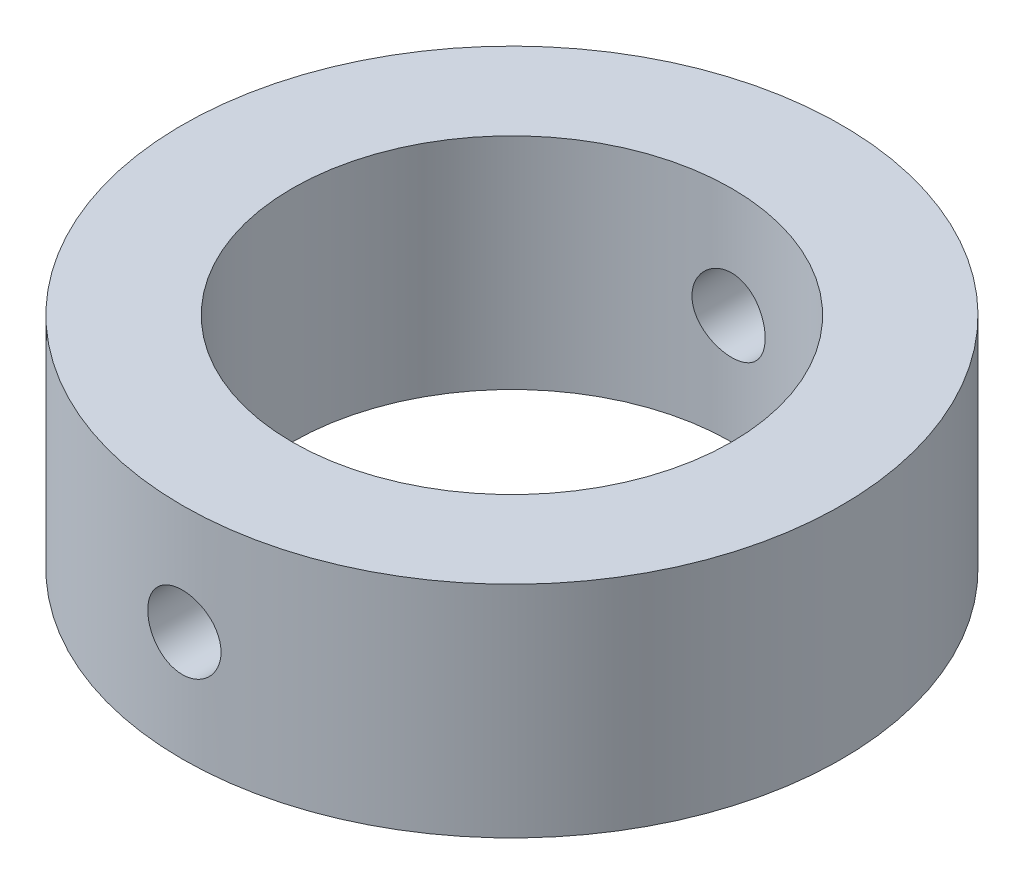
ISO-10303-21;
HEADER;
FILE_DESCRIPTION(('STEP AP214'),'2;1');
FILE_NAME('part.step','',(''),(''),'','','');
FILE_SCHEMA(('AUTOMOTIVE_DESIGN { 1 0 10303 214 1 1 1 1 }'));
ENDSEC;
DATA;
#1=APPLICATION_CONTEXT('core data for automotive mechanical design processes');
#2=APPLICATION_PROTOCOL_DEFINITION('international standard','automotive_design',2000,#1);
#3=PRODUCT_CONTEXT('',#1,'mechanical');
#4=PRODUCT('Part','Part','',(#3));
#5=PRODUCT_RELATED_PRODUCT_CATEGORY('part','',(#4));
#6=PRODUCT_DEFINITION_FORMATION('','',#4);
#7=PRODUCT_DEFINITION_CONTEXT('part definition',#1,'design');
#8=PRODUCT_DEFINITION('design','',#6,#7);
#9=PRODUCT_DEFINITION_SHAPE('','',#8);
#10=(LENGTH_UNIT() NAMED_UNIT(*) SI_UNIT(.MILLI.,.METRE.));
#11=(NAMED_UNIT(*) PLANE_ANGLE_UNIT() SI_UNIT($,.RADIAN.));
#12=(NAMED_UNIT(*) SI_UNIT($,.STERADIAN.) SOLID_ANGLE_UNIT());
#13=UNCERTAINTY_MEASURE_WITH_UNIT(LENGTH_MEASURE(1.E-05),#10,'distance_accuracy_value','');
#14=(GEOMETRIC_REPRESENTATION_CONTEXT(3) GLOBAL_UNCERTAINTY_ASSIGNED_CONTEXT((#13)) GLOBAL_UNIT_ASSIGNED_CONTEXT((#10,
#11,#12)) REPRESENTATION_CONTEXT('',''));
#15=CARTESIAN_POINT('',(0.,0.,0.));
#16=DIRECTION('',(0.,0.,1.));
#17=DIRECTION('',(1.,0.,0.));
#18=AXIS2_PLACEMENT_3D('',#15,#16,#17);
#19=CARTESIAN_POINT('',(0.,7.5,0.));
#20=DIRECTION('',(0.,1.,0.));
#21=DIRECTION('',(0.,0.,1.));
#22=AXIS2_PLACEMENT_3D('',#19,#20,#21);
#23=PLANE('',#22);
#24=CARTESIAN_POINT('',(0.,7.5,0.));
#25=DIRECTION('',(0.,1.,0.));
#26=DIRECTION('',(0.,0.,1.));
#27=AXIS2_PLACEMENT_3D('',#24,#25,#26);
#28=CIRCLE('',#27,22.5);
#29=CARTESIAN_POINT('',(0.,7.5,22.5));
#30=VERTEX_POINT('',#29);
#31=EDGE_CURVE('E10',#30,#30,#28,.T.);
#32=ORIENTED_EDGE('',*,*,#31,.T.);
#33=EDGE_LOOP('',(#32));
#34=FACE_BOUND('',#33,.T.);
#35=CARTESIAN_POINT('',(0.,7.5,0.));
#36=DIRECTION('',(0.,1.,0.));
#37=DIRECTION('',(0.,0.,1.));
#38=AXIS2_PLACEMENT_3D('',#35,#36,#37);
#39=CIRCLE('',#38,15.);
#40=CARTESIAN_POINT('',(0.,7.5,15.));
#41=VERTEX_POINT('',#40);
#42=EDGE_CURVE('E57',#41,#41,#39,.T.);
#43=ORIENTED_EDGE('',*,*,#42,.F.);
#44=EDGE_LOOP('',(#43));
#45=FACE_BOUND('',#44,.T.);
#46=ADVANCED_FACE('F40',(#34,#45),#23,.T.);
#47=CARTESIAN_POINT('',(0.,-7.5,0.));
#48=DIRECTION('',(0.,1.,0.));
#49=DIRECTION('',(0.,0.,1.));
#50=AXIS2_PLACEMENT_3D('',#47,#48,#49);
#51=PLANE('',#50);
#52=CARTESIAN_POINT('',(0.,-7.5,0.));
#53=DIRECTION('',(0.,1.,0.));
#54=DIRECTION('',(0.,0.,1.));
#55=AXIS2_PLACEMENT_3D('',#52,#53,#54);
#56=CIRCLE('',#55,22.5);
#57=CARTESIAN_POINT('',(0.,-7.5,22.5));
#58=VERTEX_POINT('',#57);
#59=EDGE_CURVE('E51',#58,#58,#56,.T.);
#60=ORIENTED_EDGE('',*,*,#59,.F.);
#61=EDGE_LOOP('',(#60));
#62=FACE_BOUND('',#61,.T.);
#63=CARTESIAN_POINT('',(0.,-7.5,0.));
#64=DIRECTION('',(0.,1.,0.));
#65=DIRECTION('',(0.,0.,1.));
#66=AXIS2_PLACEMENT_3D('',#63,#64,#65);
#67=CIRCLE('',#66,15.);
#68=CARTESIAN_POINT('',(0.,-7.5,15.));
#69=VERTEX_POINT('',#68);
#70=EDGE_CURVE('E56',#69,#69,#67,.T.);
#71=ORIENTED_EDGE('',*,*,#70,.T.);
#72=EDGE_LOOP('',(#71));
#73=FACE_BOUND('',#72,.T.);
#74=ADVANCED_FACE('F94',(#62,#73),#51,.F.);
#75=CARTESIAN_POINT('',(0.,7.5,0.));
#76=DIRECTION('',(0.,-1.,0.));
#77=DIRECTION('',(0.,0.,-1.));
#78=AXIS2_PLACEMENT_3D('',#75,#76,#77);
#79=CYLINDRICAL_SURFACE('',#78,22.5);
#80=CARTESIAN_POINT('',(0.,2.49951950797617,-22.5));
#81=CARTESIAN_POINT('',(-0.139936566942321,2.49951349299564,-22.4999982325615));
#82=CARTESIAN_POINT('',(-0.279963543737534,2.48772831347471,-22.4986806802553));
#83=CARTESIAN_POINT('',(-0.556129413892089,2.44089621222708,-22.4935514124295));
#84=CARTESIAN_POINT('',(-0.692263951659807,2.40582421963843,-22.4897370088325));
#85=CARTESIAN_POINT('',(-0.956606251018756,2.3134573098694,-22.4800442565582));
#86=CARTESIAN_POINT('',(-1.08481896993661,2.25617645726997,-22.4741672143457));
#87=CARTESIAN_POINT('',(-1.32978435674234,2.12104661871912,-22.4610048757567));
#88=CARTESIAN_POINT('',(-1.44653916691356,2.04320148775445,-22.4537198433911));
#89=CARTESIAN_POINT('',(-1.66581402663744,1.86878636650636,-22.4385206659033));
#90=CARTESIAN_POINT('',(-1.76827655576942,1.77214425938938,-22.4306041693958));
#91=CARTESIAN_POINT('',(-1.95556347982756,1.56303286820045,-22.4150535402577));
#92=CARTESIAN_POINT('',(-2.04038702549095,1.45056282249892,-22.4074194212373));
#93=CARTESIAN_POINT('',(-2.19019669760102,1.21262184541458,-22.3932743402956));
#94=CARTESIAN_POINT('',(-2.25512994013054,1.08711742330829,-22.3867663922389));
#95=CARTESIAN_POINT('',(-2.36297810787457,0.826901683193655,-22.3756405814827));
#96=CARTESIAN_POINT('',(-2.40589369732636,0.692190643073153,-22.3710226617649));
#97=CARTESIAN_POINT('',(-2.46831585800862,0.417977197764106,-22.364221622152));
#98=CARTESIAN_POINT('',(-2.4879186497747,0.278496948675705,-22.3620284968903));
#99=CARTESIAN_POINT('',(-2.50345632820557,-0.00178968046362377,-22.3602945182372));
#100=CARTESIAN_POINT('',(-2.49939197381302,-0.142596017845853,-22.3607535797973));
#101=CARTESIAN_POINT('',(-2.46778990048954,-0.420871546956869,-22.3642629578811));
#102=CARTESIAN_POINT('',(-2.44035762579861,-0.558352880880914,-22.3673016340699));
#103=CARTESIAN_POINT('',(-2.36296267019204,-0.826748276858072,-22.3756096945821));
#104=CARTESIAN_POINT('',(-2.3129996211343,-0.957662231564497,-22.3808791153548));
#105=CARTESIAN_POINT('',(-2.19184626981932,-1.20953750041353,-22.393068258476));
#106=CARTESIAN_POINT('',(-2.12060958652593,-1.33047632376271,-22.3999915800122));
#107=CARTESIAN_POINT('',(-1.95896437755779,-1.55872206933738,-22.4147055213446));
#108=CARTESIAN_POINT('',(-1.86855515894283,-1.66602849863211,-22.4224961724832));
#109=CARTESIAN_POINT('',(-1.67054422983612,-1.86457586465194,-22.438118798251));
#110=CARTESIAN_POINT('',(-1.56285152794772,-1.95572608089209,-22.4459507667513));
#111=CARTESIAN_POINT('',(-1.33364547568347,-2.11866911238147,-22.4607336478932));
#112=CARTESIAN_POINT('',(-1.2121321037653,-2.19046189745764,-22.4676845591613));
#113=CARTESIAN_POINT('',(-0.958668213847871,-2.31265003371833,-22.4799252323834));
#114=CARTESIAN_POINT('',(-0.826715240629253,-2.36304033354482,-22.4852146021081));
#115=CARTESIAN_POINT('',(-0.556149429413828,-2.4409243194772,-22.493532438111));
#116=CARTESIAN_POINT('',(-0.417536837580111,-2.46841885120411,-22.4965609878888));
#117=CARTESIAN_POINT('',(-0.138371616823879,-2.49961470574367,-22.5000051741625));
#118=CARTESIAN_POINT('',(0.00216687031390374,-2.50344112549702,-22.5004345482486));
#119=CARTESIAN_POINT('',(0.281883472827248,-2.48752135538709,-22.4986689472947));
#120=CARTESIAN_POINT('',(0.421061610931798,-2.4677755600543,-22.496474016178));
#121=CARTESIAN_POINT('',(0.693742338121992,-2.40537571624248,-22.4897151113398));
#122=CARTESIAN_POINT('',(0.827258597785817,-2.36278068944084,-22.4851572423187));
#123=CARTESIAN_POINT('',(1.08525160899779,-2.25595244769081,-22.4741833301797));
#124=CARTESIAN_POINT('',(1.20972811347817,-2.19171864159796,-22.4677672362981));
#125=CARTESIAN_POINT('',(1.4466709208528,-2.04312912229711,-22.4537592802049));
#126=CARTESIAN_POINT('',(1.55908572804911,-1.95869174634181,-22.4461626912873));
#127=CARTESIAN_POINT('',(1.76819172552229,-1.77220839035985,-22.4306601102304));
#128=CARTESIAN_POINT('',(1.86488242635305,-1.67016186241472,-22.4227541084695));
#129=CARTESIAN_POINT('',(2.04023384043542,-1.45080888516069,-22.4074819749869));
#130=CARTESIAN_POINT('',(2.11881210441408,-1.33343632125987,-22.4001184119737));
#131=CARTESIAN_POINT('',(2.25514014442246,-1.08708692959819,-22.3868053688183));
#132=CARTESIAN_POINT('',(2.31289026193777,-0.958110292133955,-22.3808558654928));
#133=CARTESIAN_POINT('',(2.40578654922071,-0.692489698107442,-22.3710612900423));
#134=CARTESIAN_POINT('',(2.44098070168861,-0.555862694217361,-22.3672117533305));
#135=CARTESIAN_POINT('',(2.48792125248885,-0.278593181927605,-22.3620395880926));
#136=CARTESIAN_POINT('',(2.49966849590903,-0.137950818437308,-22.3607168684935));
#137=CARTESIAN_POINT('',(2.49936847389169,0.14253733585615,-22.3607503412289));
#138=CARTESIAN_POINT('',(2.48745072357229,0.282383284817626,-22.3620919520695));
#139=CARTESIAN_POINT('',(2.44043170068438,0.55807248184615,-22.3672717237536));
#140=CARTESIAN_POINT('',(2.40533041085216,0.693915726932494,-22.3711098864561));
#141=CARTESIAN_POINT('',(2.31297848045335,0.957735655685456,-22.3808460620063));
#142=CARTESIAN_POINT('',(2.25573267758308,1.08571405043778,-22.3867436249294));
#143=CARTESIAN_POINT('',(2.1207296993709,1.33026776781477,-22.3999349423935));
#144=CARTESIAN_POINT('',(2.04297248263997,1.44684306742901,-22.4072286997517));
#145=CARTESIAN_POINT('',(1.86866955692667,1.66594477970529,-22.4224384475671));
#146=CARTESIAN_POINT('',(1.77202723982209,1.76839412765465,-22.4303575071057));
#147=CARTESIAN_POINT('',(1.56289444279479,1.9556746759119,-22.4458978776739));
#148=CARTESIAN_POINT('',(1.45040019869745,2.0405016797727,-22.4535191174331));
#149=CARTESIAN_POINT('',(1.21237339500683,2.19034080097817,-22.4676299869136));
#150=CARTESIAN_POINT('',(1.08680222637695,2.25529187707954,-22.4741161049462));
#151=CARTESIAN_POINT('',(0.826539465256485,2.36309688151336,-22.4851890913177));
#152=CARTESIAN_POINT('',(0.691858190528409,2.40597534961424,-22.4897780677277));
#153=CARTESIAN_POINT('',(0.463700733277442,2.45790334700822,-22.4954060426985));
#154=CARTESIAN_POINT('',(0.371675327135418,2.47348762912955,-22.4971205948378));
#155=CARTESIAN_POINT('',(0.18644665680485,2.49429768568205,-22.499418159286));
#156=CARTESIAN_POINT('',(0.0932433989642284,2.4995235159152,-22.5000011776906));
#157=CARTESIAN_POINT('',(0.,2.49951950797617,-22.5));
#158=B_SPLINE_CURVE_WITH_KNOTS('',3,(#80,#81,#82,#83,#84,#85,#86,#87,#88,#89,#90,#91,#92,#93,
#94,#95,#96,#97,#98,#99,#100,#101,#102,#103,#104,#105,#106,#107,#108,#109,#110,#111,#112,#113,
#114,#115,#116,#117,#118,#119,#120,#121,#122,#123,#124,#125,#126,#127,#128,#129,#130,#131,#132,
#133,#134,#135,#136,#137,#138,#139,#140,#141,#142,#143,#144,#145,#146,#147,#148,#149,#150,#151,
#152,#153,#154,#155,#156,#157),.UNSPECIFIED.,.T.,.F.,(4,2,2,2,2,2,2,2,2,2,2,2,2,2,2,2,2,2,2,2,2,
2,2,2,2,2,2,2,2,2,2,2,2,2,2,2,2,2,4),(0.,0.419469170639827,0.839390680670981,1.25904669311746,
1.67862409245915,2.09984418732882,2.52108455795639,2.94343538224564,3.36577346413879,
3.78636228308636,4.20693761493938,4.62562515577047,5.04431953800427,5.46393351123387,
5.88356265287799,6.3054781958513,6.72739439647461,7.14941012138495,7.57141025908289,
7.99117801110966,8.4109387375407,8.82962036790648,9.24831343705976,9.66872833377643,
10.0891563142936,10.5114619002991,10.9337605621247,11.3551578711164,11.776539991574,
12.1956223039182,12.6147049283338,13.0336960515022,13.4526880201397,13.8738823012991,
14.2951767676866,14.7177523847509,15.1398571726948,15.4193619711302,15.698865263842),.UNSPECIFIED.);
#159=CARTESIAN_POINT('',(0.,2.49951950797617,-22.5));
#160=VERTEX_POINT('',#159);
#161=EDGE_CURVE('E84',#160,#160,#158,.T.);
#162=ORIENTED_EDGE('',*,*,#161,.T.);
#163=EDGE_LOOP('',(#162));
#164=FACE_BOUND('',#163,.T.);
#165=CARTESIAN_POINT('',(2.49951950797617,0.,22.3607334904123));
#166=CARTESIAN_POINT('',(2.49951349032625,-0.139933563088635,22.3607352987092));
#167=CARTESIAN_POINT('',(2.48772879966705,-0.279957545217208,22.3620612144078));
#168=CARTESIAN_POINT('',(2.44089881667221,-0.55611719347995,22.3672203556397));
#169=CARTESIAN_POINT('',(2.40582844300117,-0.692248501664643,22.3710562846787));
#170=CARTESIAN_POINT('',(2.31346626879632,-0.956583971133125,22.3807957154267));
#171=CARTESIAN_POINT('',(2.25618860973234,-1.08479311708729,22.3866979011238));
#172=CARTESIAN_POINT('',(2.12106629242063,-1.32975251382476,22.3999032149727));
#173=CARTESIAN_POINT('',(2.04322548135443,-1.44650490246687,22.4072060809999));
#174=CARTESIAN_POINT('',(1.86881472961244,-1.665782482851,22.4224263213589));
#175=CARTESIAN_POINT('',(1.77217170645087,-1.76824939041634,22.4303460187963));
#176=CARTESIAN_POINT('',(1.56305664293313,-1.95554476884844,22.4458865756539));
#177=CARTESIAN_POINT('',(1.45058385291576,-2.04037240388837,22.4535074208992));
#178=CARTESIAN_POINT('',(1.21264045772531,-2.19018636310028,22.4676149632688));
#179=CARTESIAN_POINT('',(1.08713683384274,-2.2551205514185,22.4740986615374));
#180=CARTESIAN_POINT('',(0.826922828238211,-2.36297068772956,22.4851759724593));
#181=CARTESIAN_POINT('',(0.692212719753522,-2.40588728885635,22.4897696411781));
#182=CARTESIAN_POINT('',(0.41800218200644,-2.46831154752302,22.496532977229));
#183=CARTESIAN_POINT('',(0.278523928648306,-2.48791551950796,22.4987126153714));
#184=CARTESIAN_POINT('',(-0.00175878880195052,-2.50345624990096,22.5004362772215));
#185=CARTESIAN_POINT('',(-0.142563210948945,-2.499393754358,22.4999803840102));
#186=CARTESIAN_POINT('',(-0.420846909332,-2.46779463463794,22.4964924705081));
#187=CARTESIAN_POINT('',(-0.558338108670094,-2.44036158314738,22.4934718168157));
#188=CARTESIAN_POINT('',(-0.826752834011611,-2.36296165847862,22.4852067218342));
#189=CARTESIAN_POINT('',(-0.957676257827583,-2.31299443481395,22.4799622459569));
#190=CARTESIAN_POINT('',(-1.20956304642243,-2.19183241798279,22.4678193895053));
#191=CARTESIAN_POINT('',(-1.33050439071796,-2.12059221419325,22.4609174770982));
#192=CARTESIAN_POINT('',(-1.55875368725273,-1.9589394797643,22.4462332649436));
#193=CARTESIAN_POINT('',(-1.66606114534166,-1.86852625452943,22.4384509333052));
#194=CARTESIAN_POINT('',(-1.8646040253526,-1.67051247034835,22.4228286291724));
#195=CARTESIAN_POINT('',(-1.9557495345957,-1.56282174133184,22.4149885723418));
#196=CARTESIAN_POINT('',(-2.11868400719885,-1.33362131809712,22.4001761749959));
#197=CARTESIAN_POINT('',(-2.19047293055311,-1.21211159531886,22.3932038362739));
#198=CARTESIAN_POINT('',(-2.31265828362414,-0.958648721255103,22.3809160241928));
#199=CARTESIAN_POINT('',(-2.36304847423896,-0.826692537443383,22.375601034177));
#200=CARTESIAN_POINT('',(-2.44093125914224,-0.556119743528386,22.3672394965024));
#201=CARTESIAN_POINT('',(-2.468424718699,-0.417503385322745,22.3641928631229));
#202=CARTESIAN_POINT('',(-2.49961652596031,-0.138336369403481,22.3607282228888));
#203=CARTESIAN_POINT('',(-2.5034409718612,0.00220003310593284,22.3602962863385));
#204=CARTESIAN_POINT('',(-2.48751799807124,0.28191199318381,22.3620731566918));
#205=CARTESIAN_POINT('',(-2.46777097305514,0.4210875734982,22.3642819193801));
#206=CARTESIAN_POINT('',(-2.40537138587773,0.693755357654093,22.3710786315104));
#207=CARTESIAN_POINT('',(-2.36277904472304,0.827261512290139,22.3756603247414));
#208=CARTESIAN_POINT('',(-2.25595955570785,1.08523550051335,22.3866815908118));
#209=CARTESIAN_POINT('',(-2.19173180081399,1.20970308038254,22.3931212157792));
#210=CARTESIAN_POINT('',(-2.04315122804907,1.44663973582373,22.4071663463949));
#211=CARTESIAN_POINT('',(-1.95871521109092,1.55905635072493,22.4147766241798));
#212=CARTESIAN_POINT('',(-1.77223350656595,1.76816662787105,22.4302902358222));
#213=CARTESIAN_POINT('',(-1.67018727999884,1.8648598086887,22.4381935786439));
#214=CARTESIAN_POINT('',(-1.45083323509769,2.04021668340898,22.4534451860168));
#215=CARTESIAN_POINT('',(-1.33345924565592,2.11879786564415,22.4607908118548));
#216=CARTESIAN_POINT('',(-1.08710621505332,2.25513102420631,22.4740605048863));
#217=CARTESIAN_POINT('',(-0.958127364814743,2.31288334312986,22.4799845954607));
#218=CARTESIAN_POINT('',(-0.692508085280433,2.40578106435004,22.4897319119755));
#219=CARTESIAN_POINT('',(-0.555884944717774,2.4409754033096,22.4935596829682));
#220=CARTESIAN_POINT('',(-0.278623588504152,2.48791763581208,22.4987018239809));
#221=CARTESIAN_POINT('',(-0.137985514196068,2.49966635371148,22.5000162823697));
#222=CARTESIAN_POINT('',(0.14250509119558,2.49937067546755,22.499983496755));
#223=CARTESIAN_POINT('',(0.282357775993302,2.48745400549945,22.4986505412958));
#224=CARTESIAN_POINT('',(0.558060716885086,2.4404347756972,22.493500960468));
#225=CARTESIAN_POINT('',(0.693910972042351,2.40533221043627,22.489684334518));
#226=CARTESIAN_POINT('',(0.957745104831683,2.31297503763319,22.4799946970018));
#227=CARTESIAN_POINT('',(1.08573066298406,2.255725181709,22.4741221265565));
#228=CARTESIAN_POINT('',(1.33029701888221,2.120711876387,22.4609734029879));
#229=CARTESIAN_POINT('',(1.4468777980663,2.0429483936033,22.4536972475805));
#230=CARTESIAN_POINT('',(1.66597931180696,1.86863852538781,22.4385083248431));
#231=CARTESIAN_POINT('',(1.76842411880434,1.77199696832649,22.4305924562622));
#232=CARTESIAN_POINT('',(1.95569585986813,1.56286756675574,22.4150420068368));
#233=CARTESIAN_POINT('',(2.04051858551948,1.45037594775547,22.4074074935414));
#234=CARTESIAN_POINT('',(2.19035304335443,1.21235133331075,22.3932590799349));
#235=CARTESIAN_POINT('',(2.25530298115127,1.08677925465416,22.3867487019201));
#236=CARTESIAN_POINT('',(2.36310560623011,0.826514573942193,22.3756272651962));
#237=CARTESIAN_POINT('',(2.40598284799666,0.691832296013432,22.3710140971149));
#238=CARTESIAN_POINT('',(2.45790743067419,0.4636781117458,22.3653548832898));
#239=CARTESIAN_POINT('',(2.47349017571118,0.371657222694189,22.3636302357575));
#240=CARTESIAN_POINT('',(2.49429819064359,0.186437599110697,22.3613189400112));
#241=CARTESIAN_POINT('',(2.49952351758524,0.093238871068925,22.3607322855294));
#242=CARTESIAN_POINT('',(2.49951950797617,0.,22.3607334904123));
#243=B_SPLINE_CURVE_WITH_KNOTS('',3,(#165,#166,#167,#168,#169,#170,#171,#172,#173,#174,#175,
#176,#177,#178,#179,#180,#181,#182,#183,#184,#185,#186,#187,#188,#189,#190,#191,#192,#193,#194,
#195,#196,#197,#198,#199,#200,#201,#202,#203,#204,#205,#206,#207,#208,#209,#210,#211,#212,#213,
#214,#215,#216,#217,#218,#219,#220,#221,#222,#223,#224,#225,#226,#227,#228,#229,#230,#231,#232,
#233,#234,#235,#236,#237,#238,#239,#240,#241,#242),.UNSPECIFIED.,.T.,.F.,(4,2,2,2,2,2,2,2,2,2,2,
2,2,2,2,2,2,2,2,2,2,2,2,2,2,2,2,2,2,2,2,2,2,2,2,2,2,2,4),(0.,0.419460147257422,
0.839372835443672,1.25901856370427,1.67858583554453,2.09981773962407,2.52106959898996,
2.94341619417666,3.36575026006833,3.78633335325257,4.20690318827379,4.62561879741477,
5.04434091929642,5.46396334001305,5.88360096530421,6.30550450221582,6.72740891110174,
7.14943624784346,7.57144763543299,7.99120878099841,8.4109628982878,8.82961592900411,
9.24828070701256,9.66869974734313,10.0891316578326,10.5114426284668,10.9337466525442,
11.3551314130851,11.776501357325,12.1956032757999,12.6147052923679,13.0337174419963,
13.4527302735707,13.873912723976,14.295195643682,14.7177755318489,15.1398843050856,
15.4193755517596,15.6988652590567),.UNSPECIFIED.);
#244=CARTESIAN_POINT('',(2.49951950797617,0.,22.3607334904123));
#245=VERTEX_POINT('',#244);
#246=EDGE_CURVE('E80',#245,#245,#243,.T.);
#247=ORIENTED_EDGE('',*,*,#246,.T.);
#248=EDGE_LOOP('',(#247));
#249=FACE_BOUND('',#248,.T.);
#250=ORIENTED_EDGE('',*,*,#31,.F.);
#251=EDGE_LOOP('',(#250));
#252=FACE_BOUND('',#251,.T.);
#253=ORIENTED_EDGE('',*,*,#59,.T.);
#254=EDGE_LOOP('',(#253));
#255=FACE_BOUND('',#254,.T.);
#256=ADVANCED_FACE('F39',(#164,#249,#252,#255),#79,.T.);
#257=CARTESIAN_POINT('',(0.,7.5,0.));
#258=DIRECTION('',(0.,-1.,0.));
#259=DIRECTION('',(0.,0.,-1.));
#260=AXIS2_PLACEMENT_3D('',#257,#258,#259);
#261=CYLINDRICAL_SURFACE('',#260,15.);
#262=CARTESIAN_POINT('',(0.,2.49951950797617,-15.));
#263=CARTESIAN_POINT('',(-0.139364508090051,2.49951391974084,-14.9999976124016));
#264=CARTESIAN_POINT('',(-0.278805083450701,2.48782441516031,-14.9980375223687));
#265=CARTESIAN_POINT('',(-0.553775387569299,2.44139468045847,-14.990407083));
#266=CARTESIAN_POINT('',(-0.6893013999315,2.40663325138438,-14.984733321534));
#267=CARTESIAN_POINT('',(-0.952424536744327,2.31513834973995,-14.9703119288319));
#268=CARTESIAN_POINT('',(-1.08002804725945,2.25842284760266,-14.9615668121846));
#269=CARTESIAN_POINT('',(-1.32389140117367,2.12467678251993,-14.9419642716371));
#270=CARTESIAN_POINT('',(-1.44015254046166,2.04764854407826,-14.93110708947));
#271=CARTESIAN_POINT('',(-1.65915825809385,1.87468048955593,-14.9083680026976));
#272=CARTESIAN_POINT('',(-1.76177871786992,1.7785845503111,-14.896478127535));
#273=CARTESIAN_POINT('',(-1.94951792328077,1.57054493727059,-14.8730747286718));
#274=CARTESIAN_POINT('',(-2.03463556417907,1.45860026389285,-14.8615612287657));
#275=CARTESIAN_POINT('',(-2.18545030674606,1.22118835413026,-14.8401369672021));
#276=CARTESIAN_POINT('',(-2.25102468333759,1.09564214683007,-14.8302365037689));
#277=CARTESIAN_POINT('',(-2.36010666994937,0.835124210401792,-14.8132698284495));
#278=CARTESIAN_POINT('',(-2.40361576995246,0.700153118400152,-14.806203425197));
#279=CARTESIAN_POINT('',(-2.46694110573771,0.425932357166133,-14.7957842718184));
#280=CARTESIAN_POINT('',(-2.48697161082482,0.28673346817048,-14.7923979576961));
#281=CARTESIAN_POINT('',(-2.50343550471658,0.00691241473908168,-14.7896208523066));
#282=CARTESIAN_POINT('',(-2.49987056285801,-0.133709648306762,-14.7902297783831));
#283=CARTESIAN_POINT('',(-2.46941928926905,-0.410855752612047,-14.7953437089509));
#284=CARTESIAN_POINT('',(-2.44277365688831,-0.547407090588588,-14.799808500717));
#285=CARTESIAN_POINT('',(-2.367295112279,-0.814073544248862,-14.8120681447742));
#286=CARTESIAN_POINT('',(-2.3184614393517,-0.944188439094823,-14.8198631112369));
#287=CARTESIAN_POINT('',(-2.19974897211144,-1.19500912430259,-14.837948247387));
#288=CARTESIAN_POINT('',(-2.12977022234834,-1.31566671996562,-14.8482502219816));
#289=CARTESIAN_POINT('',(-1.97082501007247,-1.54361812477962,-14.8701804019462));
#290=CARTESIAN_POINT('',(-1.88185701562449,-1.65091085462904,-14.8818087142817));
#291=CARTESIAN_POINT('',(-1.68614732380364,-1.85048015902983,-14.9052580420452));
#292=CARTESIAN_POINT('',(-1.57919911002358,-1.94255426048701,-14.9170796602359));
#293=CARTESIAN_POINT('',(-1.35126331123236,-2.10748044067602,-14.9394504463297));
#294=CARTESIAN_POINT('',(-1.23027563583436,-2.18033239564468,-14.9499996060398));
#295=CARTESIAN_POINT('',(-0.977504959822039,-2.30476469746533,-14.968651847859));
#296=CARTESIAN_POINT('',(-0.845712994878201,-2.35632716187479,-14.9767528720934));
#297=CARTESIAN_POINT('',(-0.575174609393852,-2.43652892814993,-14.9895795431694));
#298=CARTESIAN_POINT('',(-0.43642877143349,-2.46517014690718,-14.9943054722649));
#299=CARTESIAN_POINT('',(-0.157666262038521,-2.4984419346409,-14.9998115149553));
#300=CARTESIAN_POINT('',(-0.017683636726316,-2.50335045929485,-15.0006373040512));
#301=CARTESIAN_POINT('',(0.261103895224251,-2.4897585582278,-14.9983751226579));
#302=CARTESIAN_POINT('',(0.399908846952832,-2.47125903285227,-14.995287302698));
#303=CARTESIAN_POINT('',(0.671542351432961,-2.41160734778194,-14.9855731393328));
#304=CARTESIAN_POINT('',(0.804401958299745,-2.37059279393587,-14.9789682983029));
#305=CARTESIAN_POINT('',(1.06135929938222,-2.26722199458996,-14.96295774086));
#306=CARTESIAN_POINT('',(1.18545654125218,-2.20486455101058,-14.9535518672154));
#307=CARTESIAN_POINT('',(1.42257384702941,-2.05994143227341,-14.9328694459818));
#308=CARTESIAN_POINT('',(1.53548638628149,-1.97720212644831,-14.9215771088969));
#309=CARTESIAN_POINT('',(1.7459234021546,-1.79410280470709,-14.8984220495677));
#310=CARTESIAN_POINT('',(1.84344676052755,-1.69374150941529,-14.8865592859551));
#311=CARTESIAN_POINT('',(2.02136735906124,-1.47700050799817,-14.8634526992202));
#312=CARTESIAN_POINT('',(2.10157680447576,-1.36046569493768,-14.8522165570767));
#313=CARTESIAN_POINT('',(2.24128117902843,-1.11541306183981,-14.831778870658));
#314=CARTESIAN_POINT('',(2.30077676460918,-0.986895621707338,-14.8225772619098));
#315=CARTESIAN_POINT('',(2.39708368277241,-0.722051030086159,-14.8073081094559));
#316=CARTESIAN_POINT('',(2.4339885004391,-0.5857586503762,-14.8012276668585));
#317=CARTESIAN_POINT('',(2.48436045898921,-0.308799674697843,-14.7928569373731));
#318=CARTESIAN_POINT('',(2.49782963663339,-0.168133459935374,-14.7905663211171));
#319=CARTESIAN_POINT('',(2.50089119274573,0.111704911605076,-14.7900487863136));
#320=CARTESIAN_POINT('',(2.49077917213326,0.250873829694831,-14.7917715578685));
#321=CARTESIAN_POINT('',(2.44760455036403,0.525500624029804,-14.7989764260766));
#322=CARTESIAN_POINT('',(2.41454202351292,0.660958512288554,-14.8044585105584));
#323=CARTESIAN_POINT('',(2.32651813125836,0.924203849205372,-14.8185451968417));
#324=CARTESIAN_POINT('',(2.27158220602356,1.05200001096706,-14.8271461701411));
#325=CARTESIAN_POINT('',(2.14140132424513,1.29660967241631,-14.8465050441113));
#326=CARTESIAN_POINT('',(2.06615536104559,1.4134226273402,-14.8572630516874));
#327=CARTESIAN_POINT('',(1.8964353757655,1.63424343555271,-14.8798833344046));
#328=CARTESIAN_POINT('',(1.80174388637879,1.73808298358349,-14.891757193263));
#329=CARTESIAN_POINT('',(1.59627925728131,1.9284998667607,-14.9151788905582));
#330=CARTESIAN_POINT('',(1.48550241124332,2.01507321255231,-14.9267266531227));
#331=CARTESIAN_POINT('',(1.25010284689541,2.16904628319356,-14.9482873947497));
#332=CARTESIAN_POINT('',(1.12538982861585,2.23630952622658,-14.9582892288539));
#333=CARTESIAN_POINT('',(0.866319055407545,2.34882807966396,-14.9755226878044));
#334=CARTESIAN_POINT('',(0.731971060544027,2.39410530999085,-14.9827570702497));
#335=CARTESIAN_POINT('',(0.497584204416906,2.45153857248201,-14.9920617116982));
#336=CARTESIAN_POINT('',(0.398963238003195,2.46950260758348,-14.9950226587406));
#337=CARTESIAN_POINT('',(0.200241255570503,2.49349498035768,-14.9989926439026));
#338=CARTESIAN_POINT('',(0.100140265047428,2.49952352339856,-15.000001715607));
#339=CARTESIAN_POINT('',(0.,2.49951950797617,-15.));
#340=B_SPLINE_CURVE_WITH_KNOTS('',3,(#262,#263,#264,#265,#266,#267,#268,#269,#270,#271,#272,
#273,#274,#275,#276,#277,#278,#279,#280,#281,#282,#283,#284,#285,#286,#287,#288,#289,#290,#291,
#292,#293,#294,#295,#296,#297,#298,#299,#300,#301,#302,#303,#304,#305,#306,#307,#308,#309,#310,
#311,#312,#313,#314,#315,#316,#317,#318,#319,#320,#321,#322,#323,#324,#325,#326,#327,#328,#329,
#330,#331,#332,#333,#334,#335,#336,#337,#338,#339),.UNSPECIFIED.,.T.,.F.,(4,2,2,2,2,2,2,2,2,2,2,
2,2,2,2,2,2,2,2,2,2,2,2,2,2,2,2,2,2,2,2,2,2,2,2,2,2,2,4),(0.,0.417727482419845,
0.835839313653552,1.25360962210113,1.67133214340909,2.09262761994099,2.51394967948921,
2.93786429825656,3.36175028789557,3.78173694185996,4.20169388281742,4.61732327780509,
5.03296692338036,5.45060695117581,5.86828068433792,6.29112826542388,6.71397856897748,
7.13718333325395,7.56035270144144,7.97855373125131,8.39673867625476,8.81239579080643,
9.2280762420286,9.64742832477883,10.0668108655464,10.4905360413353,10.9142477876341,
11.336194063113,11.7581036659621,12.1747529216639,12.5914008284082,13.0075655557862,
13.4237509139297,13.8448723877715,14.2660910492655,14.6902174032254,15.1139200331127,
15.4140829739528,15.7142407499921),.UNSPECIFIED.);
#341=CARTESIAN_POINT('',(0.,2.49951950797617,-15.));
#342=VERTEX_POINT('',#341);
#343=EDGE_CURVE('E45',#342,#342,#340,.T.);
#344=ORIENTED_EDGE('',*,*,#343,.F.);
#345=EDGE_LOOP('',(#344));
#346=FACE_BOUND('',#345,.T.);
#347=CARTESIAN_POINT('',(2.49951950797617,0.,14.7902806676968));
#348=CARTESIAN_POINT('',(2.49951390711985,-0.139349365809991,14.7902831828109));
#349=CARTESIAN_POINT('',(2.48782685682311,-0.278774836685687,14.7922713689488));
#350=CARTESIAN_POINT('',(2.44140775479433,-0.553713768241621,14.8000020500406));
#351=CARTESIAN_POINT('',(2.40665444834883,-0.689223500418193,14.8057480075721));
#352=CARTESIAN_POINT('',(2.31518329906082,-0.952312180609978,14.8203257841133));
#353=CARTESIAN_POINT('',(2.25848380994157,-1.07989765253742,14.8291550239538));
#354=CARTESIAN_POINT('',(2.12477547718308,-1.32373066814246,14.8489014829869));
#355=CARTESIAN_POINT('',(2.04776892006547,-1.43997948627966,14.8598184670671));
#356=CARTESIAN_POINT('',(1.87482296411058,-1.65899864697021,14.8826305430465));
#357=CARTESIAN_POINT('',(1.77872258178341,-1.76164107815494,14.8945334119882));
#358=CARTESIAN_POINT('',(1.57066479552303,-1.94942282319712,14.9179070148848));
#359=CARTESIAN_POINT('',(1.45870645256995,-2.0345610998239,14.9293777231987));
#360=CARTESIAN_POINT('',(1.22128210044731,-2.18539779898971,14.9506768549743));
#361=CARTESIAN_POINT('',(1.09573947214465,-2.25097718386523,14.9604950697501));
#362=CARTESIAN_POINT('',(0.835229296731664,-2.36006941068147,14.9772964256258));
#363=CARTESIAN_POINT('',(0.700262362855328,-2.4035836868663,14.984279750989));
#364=CARTESIAN_POINT('',(0.426056241050663,-2.4669192839129,14.9945695960977));
#365=CARTESIAN_POINT('',(0.286867963478677,-2.48695551334058,14.9979094469321));
#366=CARTESIAN_POINT('',(0.00706782838656497,-2.50343453490502,15.0006505476958));
#367=CARTESIAN_POINT('',(-0.133543931759133,-2.49987893011533,15.0000520652362));
#368=CARTESIAN_POINT('',(-0.410730197715819,-2.46944281702467,14.995010317991));
#369=CARTESIAN_POINT('',(-0.547330891989683,-2.44279359249101,14.9906051782965));
#370=CARTESIAN_POINT('',(-0.814094187858249,-2.36729090105945,14.978487596677));
#371=CARTESIAN_POINT('',(-0.944256593296434,-2.31843675810173,14.9707750540538));
#372=CARTESIAN_POINT('',(-1.19513632780999,-2.19968114933952,14.9528443529639));
#373=CARTESIAN_POINT('',(-1.31580770212544,-2.12968437748151,14.9426148883478));
#374=CARTESIAN_POINT('',(-1.54377909870456,-1.97070028887235,14.9207868491946));
#375=CARTESIAN_POINT('',(-1.6510780380468,-1.88171143569251,14.9091881639237));
#376=CARTESIAN_POINT('',(-1.85062520549815,-1.68598645972793,14.8857455724887));
#377=CARTESIAN_POINT('',(-1.94267512650727,-1.57904819642668,14.8739003982963));
#378=CARTESIAN_POINT('',(-2.10755719170449,-1.35114108952868,14.8514359022846));
#379=CARTESIAN_POINT('',(-2.18038915875381,-1.23017211662064,14.8408165917652));
#380=CARTESIAN_POINT('',(-2.30480686397567,-0.97740749471038,14.8220055377522));
#381=CARTESIAN_POINT('',(-2.35636872960267,-0.845599878768573,14.8138165247839));
#382=CARTESIAN_POINT('',(-2.43656454914658,-0.575027331016361,14.8008384727657));
#383=CARTESIAN_POINT('',(-2.46520052105572,-0.436263012694427,14.7960491344724));
#384=CARTESIAN_POINT('',(-2.49845245006704,-0.157490371881397,14.7904705852765));
#385=CARTESIAN_POINT('',(-2.50335109382307,-0.0175166797061846,14.7896343006128));
#386=CARTESIAN_POINT('',(-2.48974261991658,0.261250651338298,14.7919311619668));
#387=CARTESIAN_POINT('',(-2.47123640592732,0.400044335559969,14.7950641547288));
#388=CARTESIAN_POINT('',(-2.4115845545185,0.671613862482586,14.8049030694247));
#389=CARTESIAN_POINT('',(-2.37058280368426,0.804422206535977,14.8115862748443));
#390=CARTESIAN_POINT('',(-2.26725467381288,1.06128265106907,14.8277535213586));
#391=CARTESIAN_POINT('',(-2.20492701953009,1.18533422737661,14.837237729943));
#392=CARTESIAN_POINT('',(-2.0600491295688,1.42241790049665,14.8580477297067));
#393=CARTESIAN_POINT('',(-1.97731773783246,1.53533785072526,14.8693896942351));
#394=CARTESIAN_POINT('',(-1.79422946439283,1.74579347623513,14.8925899393209));
#395=CARTESIAN_POINT('',(-1.69387134348065,1.8433280689666,14.9044482561351));
#396=CARTESIAN_POINT('',(-1.47712600420299,2.02127656220014,14.9274939637743));
#397=CARTESIAN_POINT('',(-1.36058300015941,2.10150194359244,14.9386730984668));
#398=CARTESIAN_POINT('',(-1.11550938712703,2.24123424143848,14.958968388732));
#399=CARTESIAN_POINT('',(-0.986979165955468,2.30074182787143,14.9680846110125));
#400=CARTESIAN_POINT('',(-0.722139732049124,2.39705596186641,14.9831910390726));
#401=CARTESIAN_POINT('',(-0.585867206416489,2.43396117023019,14.9891948129873));
#402=CARTESIAN_POINT('',(-0.308950396162067,2.48434062426371,14.9974572419129));
#403=CARTESIAN_POINT('',(-0.168306472082436,2.49781679711016,14.999716204956));
#404=CARTESIAN_POINT('',(0.111541179022018,2.50090020183128,15.0002301365587));
#405=CARTESIAN_POINT('',(0.250741740615862,2.490794276505,14.9985332229952));
#406=CARTESIAN_POINT('',(0.525433420086801,2.44762077317734,14.9914242981592));
#407=CARTESIAN_POINT('',(0.66092455871129,2.41455332363072,14.9860123076701));
#408=CARTESIAN_POINT('',(0.924241828146745,2.32650548508981,14.9720792121945));
#409=CARTESIAN_POINT('',(1.05207630518664,2.27154947515527,14.9635615671161));
#410=CARTESIAN_POINT('',(1.2967543196963,2.14131646195423,14.9443469974131));
#411=CARTESIAN_POINT('',(1.4135973361201,2.06603849598715,14.9336499695518));
#412=CARTESIAN_POINT('',(1.63442062615962,1.89628154442587,14.9111081721286));
#413=CARTESIAN_POINT('',(1.73823824594068,1.80159251215727,14.8992516600188));
#414=CARTESIAN_POINT('',(1.9286120269479,1.59614205068992,14.8758085261241));
#415=CARTESIAN_POINT('',(2.01516413938322,1.48537686210087,14.8642219682051));
#416=CARTESIAN_POINT('',(2.16911221962715,1.2499884667428,14.8425421086335));
#417=CARTESIAN_POINT('',(2.2363684174,1.12527281446474,14.8324599442519));
#418=CARTESIAN_POINT('',(2.3488730875988,0.866196865150776,14.8150620479966));
#419=CARTESIAN_POINT('',(2.39414354722136,0.731846358612558,14.8077435539056));
#420=CARTESIAN_POINT('',(2.45155933152337,0.497477222572005,14.7983247641839));
#421=CARTESIAN_POINT('',(2.46951554320917,0.398877677819384,14.7953250004592));
#422=CARTESIAN_POINT('',(2.4934975352474,0.200198499388908,14.7913020666237));
#423=CARTESIAN_POINT('',(2.49952353204566,0.100118892596505,14.7902788606528));
#424=CARTESIAN_POINT('',(2.49951950797617,0.,14.7902806676968));
#425=B_SPLINE_CURVE_WITH_KNOTS('',3,(#347,#348,#349,#350,#351,#352,#353,#354,#355,#356,#357,
#358,#359,#360,#361,#362,#363,#364,#365,#366,#367,#368,#369,#370,#371,#372,#373,#374,#375,#376,
#377,#378,#379,#380,#381,#382,#383,#384,#385,#386,#387,#388,#389,#390,#391,#392,#393,#394,#395,
#396,#397,#398,#399,#400,#401,#402,#403,#404,#405,#406,#407,#408,#409,#410,#411,#412,#413,#414,
#415,#416,#417,#418,#419,#420,#421,#422,#423,#424),.UNSPECIFIED.,.T.,.F.,(4,2,2,2,2,2,2,2,2,2,2,
2,2,2,2,2,2,2,2,2,2,2,2,2,2,2,2,2,2,2,2,2,2,2,2,2,2,2,4),(0.,0.41768198004153,0.835749374125834,
1.25346788877197,1.67113938949627,2.09249442847333,2.51387442818139,2.93776898152677,
3.3616359779619,3.78159198389555,4.20151945396101,4.61728930574547,5.03307181707308,
5.45075728217881,5.8684765501808,6.2912616724777,6.71405069160064,7.13731294627902,
7.56053794029958,7.9787101697165,8.39686625378753,8.81237838033037,9.22791535799679,
9.64728363521481,10.0666814070178,10.4904390445522,10.9141829771922,11.3360638065377,
11.7579099320483,12.1746516897004,12.5913911159729,13.0076676780269,13.4239639635779,
13.8450283691455,14.2661913992567,14.6903322544004,15.1140480625968,15.4141471392167,
15.7142407711912),.UNSPECIFIED.);
#426=CARTESIAN_POINT('',(2.49951950797617,0.,14.7902806676968));
#427=VERTEX_POINT('',#426);
#428=EDGE_CURVE('E63',#427,#427,#425,.T.);
#429=ORIENTED_EDGE('',*,*,#428,.F.);
#430=EDGE_LOOP('',(#429));
#431=FACE_BOUND('',#430,.T.);
#432=ORIENTED_EDGE('',*,*,#42,.T.);
#433=EDGE_LOOP('',(#432));
#434=FACE_BOUND('',#433,.T.);
#435=ORIENTED_EDGE('',*,*,#70,.F.);
#436=EDGE_LOOP('',(#435));
#437=FACE_BOUND('',#436,.T.);
#438=ADVANCED_FACE('F67',(#346,#431,#434,#437),#261,.F.);
#439=CARTESIAN_POINT('',(0.,0.,-22.5));
#440=DIRECTION('',(0.,0.,1.));
#441=DIRECTION('',(1.,0.,0.));
#442=AXIS2_PLACEMENT_3D('',#439,#440,#441);
#443=CYLINDRICAL_SURFACE('',#442,2.49951950797617);
#444=ORIENTED_EDGE('',*,*,#428,.T.);
#445=EDGE_LOOP('',(#444));
#446=FACE_BOUND('',#445,.T.);
#447=ORIENTED_EDGE('',*,*,#246,.F.);
#448=EDGE_LOOP('',(#447));
#449=FACE_BOUND('',#448,.T.);
#450=ADVANCED_FACE('F75',(#446,#449),#443,.F.);
#451=ORIENTED_EDGE('',*,*,#343,.T.);
#452=EDGE_LOOP('',(#451));
#453=FACE_BOUND('',#452,.T.);
#454=ORIENTED_EDGE('',*,*,#161,.F.);
#455=EDGE_LOOP('',(#454));
#456=FACE_BOUND('',#455,.T.);
#457=ADVANCED_FACE('F69',(#453,#456),#443,.F.);
#458=CLOSED_SHELL('',(#46,#74,#256,#438,#450,#457));
#459=MANIFOLD_SOLID_BREP('B2',#458);
#460=ADVANCED_BREP_SHAPE_REPRESENTATION('',(#18,#459),#14);
#461=SHAPE_DEFINITION_REPRESENTATION(#9,#460);
ENDSEC;
END-ISO-10303-21;
